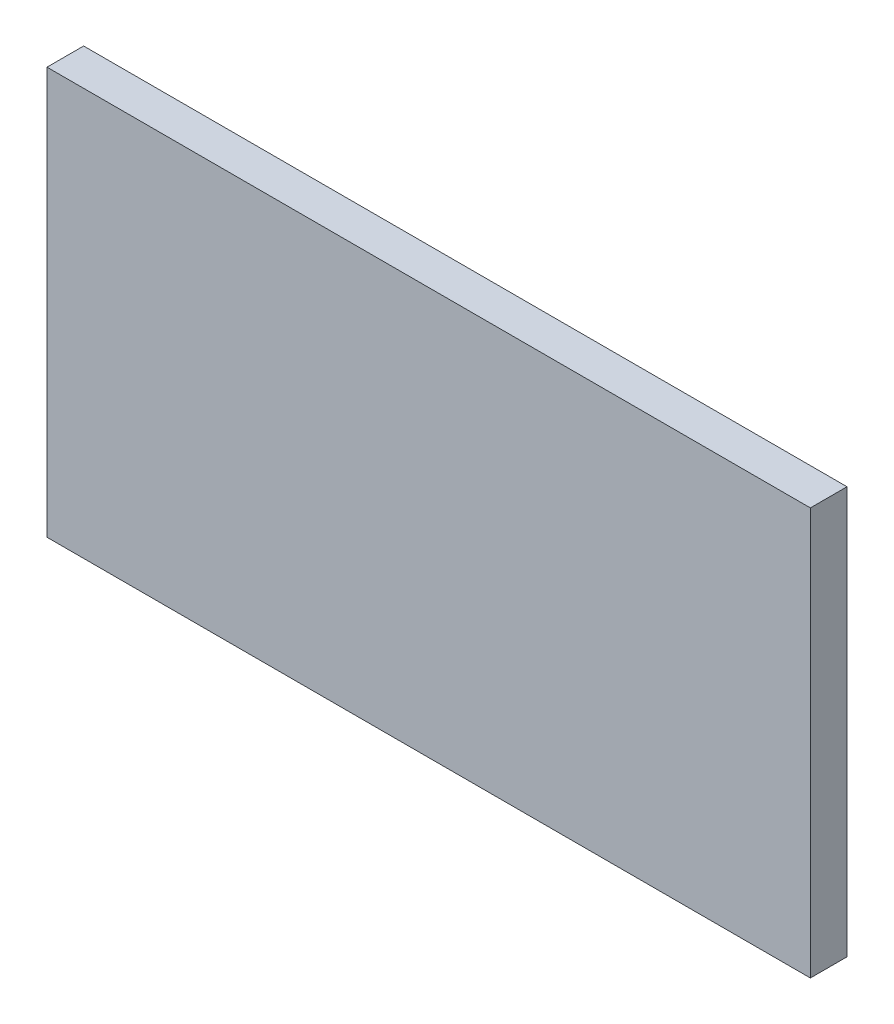
ISO-10303-21;
HEADER;
FILE_DESCRIPTION(('STEP AP214'),'2;1');
FILE_NAME('part.step','',(''),(''),'','','');
FILE_SCHEMA(('AUTOMOTIVE_DESIGN { 1 0 10303 214 1 1 1 1 }'));
ENDSEC;
DATA;
#1=APPLICATION_CONTEXT('core data for automotive mechanical design processes');
#2=APPLICATION_PROTOCOL_DEFINITION('international standard','automotive_design',2000,#1);
#3=PRODUCT_CONTEXT('',#1,'mechanical');
#4=PRODUCT('Part','Part','',(#3));
#5=PRODUCT_RELATED_PRODUCT_CATEGORY('part','',(#4));
#6=PRODUCT_DEFINITION_FORMATION('','',#4);
#7=PRODUCT_DEFINITION_CONTEXT('part definition',#1,'design');
#8=PRODUCT_DEFINITION('design','',#6,#7);
#9=PRODUCT_DEFINITION_SHAPE('','',#8);
#10=(LENGTH_UNIT() NAMED_UNIT(*) SI_UNIT(.MILLI.,.METRE.));
#11=(NAMED_UNIT(*) PLANE_ANGLE_UNIT() SI_UNIT($,.RADIAN.));
#12=(NAMED_UNIT(*) SI_UNIT($,.STERADIAN.) SOLID_ANGLE_UNIT());
#13=UNCERTAINTY_MEASURE_WITH_UNIT(LENGTH_MEASURE(1.E-05),#10,'distance_accuracy_value','');
#14=(GEOMETRIC_REPRESENTATION_CONTEXT(3) GLOBAL_UNCERTAINTY_ASSIGNED_CONTEXT((#13)) GLOBAL_UNIT_ASSIGNED_CONTEXT((#10,
#11,#12)) REPRESENTATION_CONTEXT('',''));
#15=CARTESIAN_POINT('',(0.,0.,0.));
#16=DIRECTION('',(0.,0.,1.));
#17=DIRECTION('',(1.,0.,0.));
#18=AXIS2_PLACEMENT_3D('',#15,#16,#17);
#19=CARTESIAN_POINT('',(-187.5,250.,205.5));
#20=DIRECTION('',(1.,0.,0.));
#21=DIRECTION('',(0.,0.,-1.));
#22=AXIS2_PLACEMENT_3D('',#19,#20,#21);
#23=PLANE('',#22);
#24=DIRECTION('',(0.,0.,1.));
#25=VECTOR('',#24,1.);
#26=CARTESIAN_POINT('',(-187.5,50.,205.5));
#27=LINE('',#26,#25);
#28=CARTESIAN_POINT('',(-187.5,50.,187.5));
#29=VERTEX_POINT('',#28);
#30=CARTESIAN_POINT('',(-187.5,50.,205.5));
#31=VERTEX_POINT('',#30);
#32=EDGE_CURVE('E107',#29,#31,#27,.T.);
#33=ORIENTED_EDGE('',*,*,#32,.T.);
#34=DIRECTION('',(0.,-1.,0.));
#35=VECTOR('',#34,1.);
#36=CARTESIAN_POINT('',(-187.5,250.,205.5));
#37=LINE('',#36,#35);
#38=CARTESIAN_POINT('',(-187.5,250.,205.5));
#39=VERTEX_POINT('',#38);
#40=EDGE_CURVE('E11',#39,#31,#37,.T.);
#41=ORIENTED_EDGE('',*,*,#40,.F.);
#42=DIRECTION('',(0.,0.,1.));
#43=VECTOR('',#42,1.);
#44=CARTESIAN_POINT('',(-187.5,250.,205.5));
#45=LINE('',#44,#43);
#46=CARTESIAN_POINT('',(-187.5,250.,187.5));
#47=VERTEX_POINT('',#46);
#48=EDGE_CURVE('E91',#47,#39,#45,.T.);
#49=ORIENTED_EDGE('',*,*,#48,.F.);
#50=DIRECTION('',(0.,-1.,0.));
#51=VECTOR('',#50,1.);
#52=CARTESIAN_POINT('',(-187.5,250.,187.5));
#53=LINE('',#52,#51);
#54=EDGE_CURVE('E103',#47,#29,#53,.T.);
#55=ORIENTED_EDGE('',*,*,#54,.T.);
#56=EDGE_LOOP('',(#33,#41,#49,#55));
#57=FACE_BOUND('',#56,.T.);
#58=ADVANCED_FACE('F39',(#57),#23,.F.);
#59=CARTESIAN_POINT('',(-187.5,250.,205.5));
#60=DIRECTION('',(0.,0.,-1.));
#61=DIRECTION('',(-1.,0.,0.));
#62=AXIS2_PLACEMENT_3D('',#59,#60,#61);
#63=PLANE('',#62);
#64=DIRECTION('',(1.,0.,0.));
#65=VECTOR('',#64,1.);
#66=CARTESIAN_POINT('',(-187.5,50.,205.5));
#67=LINE('',#66,#65);
#68=CARTESIAN_POINT('',(187.5,50.,205.5));
#69=VERTEX_POINT('',#68);
#70=EDGE_CURVE('E96',#31,#69,#67,.T.);
#71=ORIENTED_EDGE('',*,*,#70,.T.);
#72=DIRECTION('',(0.,-1.,0.));
#73=VECTOR('',#72,1.);
#74=CARTESIAN_POINT('',(187.5,250.,205.5));
#75=LINE('',#74,#73);
#76=CARTESIAN_POINT('',(187.5,250.,205.5));
#77=VERTEX_POINT('',#76);
#78=EDGE_CURVE('E48',#77,#69,#75,.T.);
#79=ORIENTED_EDGE('',*,*,#78,.F.);
#80=DIRECTION('',(1.,0.,0.));
#81=VECTOR('',#80,1.);
#82=CARTESIAN_POINT('',(-187.5,250.,205.5));
#83=LINE('',#82,#81);
#84=EDGE_CURVE('E86',#39,#77,#83,.T.);
#85=ORIENTED_EDGE('',*,*,#84,.F.);
#86=ORIENTED_EDGE('',*,*,#40,.T.);
#87=EDGE_LOOP('',(#71,#79,#85,#86));
#88=FACE_BOUND('',#87,.T.);
#89=ADVANCED_FACE('F95',(#88),#63,.F.);
#90=CARTESIAN_POINT('',(187.5,250.,205.5));
#91=DIRECTION('',(-1.,0.,0.));
#92=DIRECTION('',(0.,0.,1.));
#93=AXIS2_PLACEMENT_3D('',#90,#91,#92);
#94=PLANE('',#93);
#95=DIRECTION('',(0.,0.,-1.));
#96=VECTOR('',#95,1.);
#97=CARTESIAN_POINT('',(187.5,50.,205.5));
#98=LINE('',#97,#96);
#99=CARTESIAN_POINT('',(187.5,50.,187.5));
#100=VERTEX_POINT('',#99);
#101=EDGE_CURVE('E73',#69,#100,#98,.T.);
#102=ORIENTED_EDGE('',*,*,#101,.T.);
#103=DIRECTION('',(0.,-1.,0.));
#104=VECTOR('',#103,1.);
#105=CARTESIAN_POINT('',(187.5,250.,187.5));
#106=LINE('',#105,#104);
#107=CARTESIAN_POINT('',(187.5,250.,187.5));
#108=VERTEX_POINT('',#107);
#109=EDGE_CURVE('E98',#108,#100,#106,.T.);
#110=ORIENTED_EDGE('',*,*,#109,.F.);
#111=DIRECTION('',(0.,0.,-1.));
#112=VECTOR('',#111,1.);
#113=CARTESIAN_POINT('',(187.5,250.,205.5));
#114=LINE('',#113,#112);
#115=EDGE_CURVE('E89',#77,#108,#114,.T.);
#116=ORIENTED_EDGE('',*,*,#115,.F.);
#117=ORIENTED_EDGE('',*,*,#78,.T.);
#118=EDGE_LOOP('',(#102,#110,#116,#117));
#119=FACE_BOUND('',#118,.T.);
#120=ADVANCED_FACE('F99',(#119),#94,.F.);
#121=CARTESIAN_POINT('',(-187.5,250.,187.5));
#122=DIRECTION('',(0.,0.,1.));
#123=DIRECTION('',(1.,0.,0.));
#124=AXIS2_PLACEMENT_3D('',#121,#122,#123);
#125=PLANE('',#124);
#126=DIRECTION('',(-1.,0.,0.));
#127=VECTOR('',#126,1.);
#128=CARTESIAN_POINT('',(-187.5,50.,187.5));
#129=LINE('',#128,#127);
#130=EDGE_CURVE('E79',#100,#29,#129,.T.);
#131=ORIENTED_EDGE('',*,*,#130,.T.);
#132=ORIENTED_EDGE('',*,*,#54,.F.);
#133=DIRECTION('',(-1.,0.,0.));
#134=VECTOR('',#133,1.);
#135=CARTESIAN_POINT('',(-187.5,250.,187.5));
#136=LINE('',#135,#134);
#137=EDGE_CURVE('E56',#108,#47,#136,.T.);
#138=ORIENTED_EDGE('',*,*,#137,.F.);
#139=ORIENTED_EDGE('',*,*,#109,.T.);
#140=EDGE_LOOP('',(#131,#132,#138,#139));
#141=FACE_BOUND('',#140,.T.);
#142=ADVANCED_FACE('F120',(#141),#125,.F.);
#143=CARTESIAN_POINT('',(0.,250.,0.));
#144=DIRECTION('',(0.,-1.,0.));
#145=DIRECTION('',(0.,0.,-1.));
#146=AXIS2_PLACEMENT_3D('',#143,#144,#145);
#147=PLANE('',#146);
#148=ORIENTED_EDGE('',*,*,#48,.T.);
#149=ORIENTED_EDGE('',*,*,#84,.T.);
#150=ORIENTED_EDGE('',*,*,#115,.T.);
#151=ORIENTED_EDGE('',*,*,#137,.T.);
#152=EDGE_LOOP('',(#148,#149,#150,#151));
#153=FACE_BOUND('',#152,.T.);
#154=ADVANCED_FACE('F87',(#153),#147,.F.);
#155=CARTESIAN_POINT('',(0.,50.,0.));
#156=DIRECTION('',(0.,-1.,0.));
#157=DIRECTION('',(0.,0.,-1.));
#158=AXIS2_PLACEMENT_3D('',#155,#156,#157);
#159=PLANE('',#158);
#160=ORIENTED_EDGE('',*,*,#32,.F.);
#161=ORIENTED_EDGE('',*,*,#130,.F.);
#162=ORIENTED_EDGE('',*,*,#101,.F.);
#163=ORIENTED_EDGE('',*,*,#70,.F.);
#164=EDGE_LOOP('',(#160,#161,#162,#163));
#165=FACE_BOUND('',#164,.T.);
#166=ADVANCED_FACE('F123',(#165),#159,.T.);
#167=CLOSED_SHELL('',(#58,#89,#120,#142,#154,#166));
#168=MANIFOLD_SOLID_BREP('B2',#167);
#169=ADVANCED_BREP_SHAPE_REPRESENTATION('',(#18,#168),#14);
#170=SHAPE_DEFINITION_REPRESENTATION(#9,#169);
ENDSEC;
END-ISO-10303-21;
